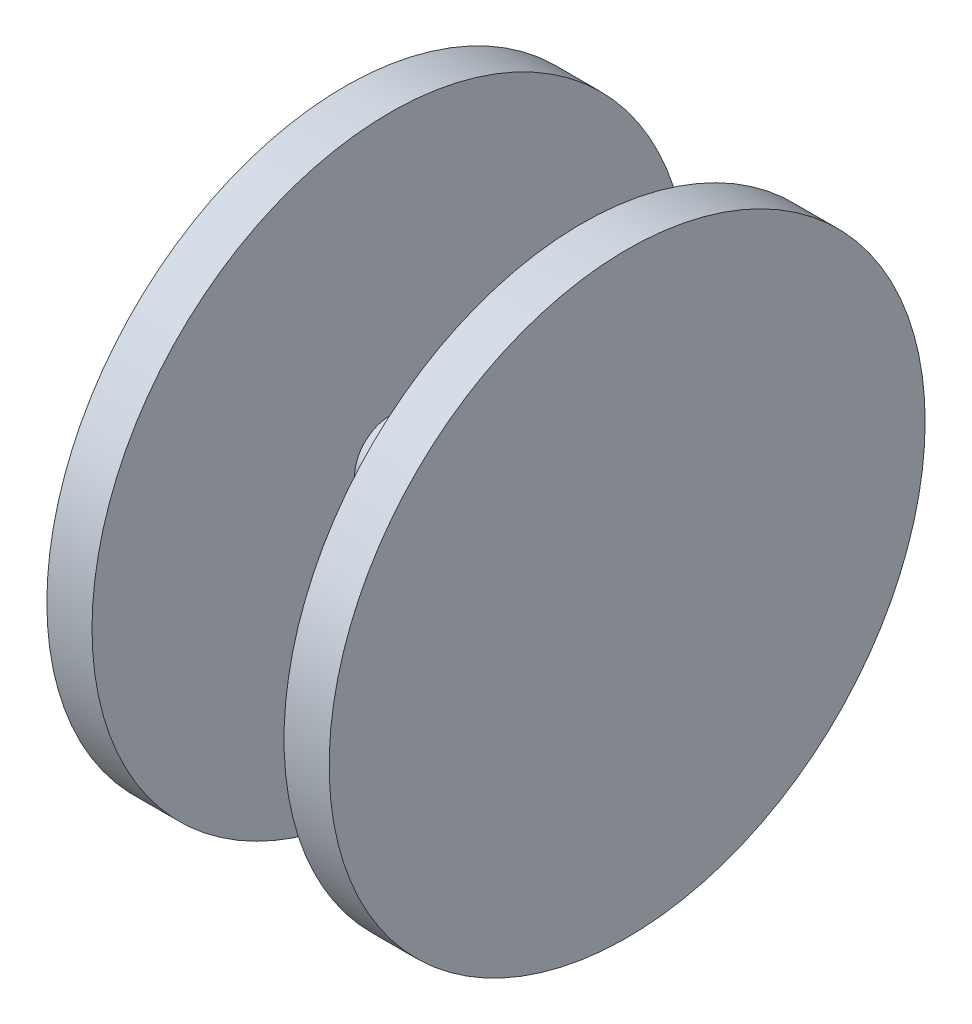
ISO-10303-21;
HEADER;
FILE_DESCRIPTION(('STEP AP214'),'2;1');
FILE_NAME('part.step','',(''),(''),'','','');
FILE_SCHEMA(('AUTOMOTIVE_DESIGN { 1 0 10303 214 1 1 1 1 }'));
ENDSEC;
DATA;
#1=APPLICATION_CONTEXT('core data for automotive mechanical design processes');
#2=APPLICATION_PROTOCOL_DEFINITION('international standard','automotive_design',2000,#1);
#3=PRODUCT_CONTEXT('',#1,'mechanical');
#4=PRODUCT('Part','Part','',(#3));
#5=PRODUCT_RELATED_PRODUCT_CATEGORY('part','',(#4));
#6=PRODUCT_DEFINITION_FORMATION('','',#4);
#7=PRODUCT_DEFINITION_CONTEXT('part definition',#1,'design');
#8=PRODUCT_DEFINITION('design','',#6,#7);
#9=PRODUCT_DEFINITION_SHAPE('','',#8);
#10=(LENGTH_UNIT() NAMED_UNIT(*) SI_UNIT(.MILLI.,.METRE.));
#11=(NAMED_UNIT(*) PLANE_ANGLE_UNIT() SI_UNIT($,.RADIAN.));
#12=(NAMED_UNIT(*) SI_UNIT($,.STERADIAN.) SOLID_ANGLE_UNIT());
#13=UNCERTAINTY_MEASURE_WITH_UNIT(LENGTH_MEASURE(1.E-05),#10,'distance_accuracy_value','');
#14=(GEOMETRIC_REPRESENTATION_CONTEXT(3) GLOBAL_UNCERTAINTY_ASSIGNED_CONTEXT((#13)) GLOBAL_UNIT_ASSIGNED_CONTEXT((#10,
#11,#12)) REPRESENTATION_CONTEXT('',''));
#15=CARTESIAN_POINT('',(0.,0.,0.));
#16=DIRECTION('',(0.,0.,1.));
#17=DIRECTION('',(1.,0.,0.));
#18=AXIS2_PLACEMENT_3D('',#15,#16,#17);
#19=CARTESIAN_POINT('',(6.35,0.,0.));
#20=DIRECTION('',(-1.,0.,0.));
#21=DIRECTION('',(0.,0.,1.));
#22=AXIS2_PLACEMENT_3D('',#19,#20,#21);
#23=CYLINDRICAL_SURFACE('',#22,41.91);
#24=CARTESIAN_POINT('',(6.35,0.,0.));
#25=DIRECTION('',(1.,0.,0.));
#26=DIRECTION('',(0.,0.,-1.));
#27=AXIS2_PLACEMENT_3D('',#24,#25,#26);
#28=CIRCLE('',#27,41.91);
#29=CARTESIAN_POINT('',(6.35,0.,-41.91));
#30=VERTEX_POINT('',#29);
#31=EDGE_CURVE('E44',#30,#30,#28,.T.);
#32=ORIENTED_EDGE('',*,*,#31,.F.);
#33=EDGE_LOOP('',(#32));
#34=FACE_BOUND('',#33,.T.);
#35=CARTESIAN_POINT('',(0.,0.,0.));
#36=DIRECTION('',(1.,0.,0.));
#37=DIRECTION('',(0.,0.,-1.));
#38=AXIS2_PLACEMENT_3D('',#35,#36,#37);
#39=CIRCLE('',#38,41.91);
#40=CARTESIAN_POINT('',(0.,0.,-41.91));
#41=VERTEX_POINT('',#40);
#42=EDGE_CURVE('E47',#41,#41,#39,.T.);
#43=ORIENTED_EDGE('',*,*,#42,.T.);
#44=EDGE_LOOP('',(#43));
#45=FACE_BOUND('',#44,.T.);
#46=ADVANCED_FACE('F39',(#34,#45),#23,.T.);
#47=CARTESIAN_POINT('',(6.35,0.,0.));
#48=DIRECTION('',(1.,0.,0.));
#49=DIRECTION('',(0.,0.,-1.));
#50=AXIS2_PLACEMENT_3D('',#47,#48,#49);
#51=PLANE('',#50);
#52=ORIENTED_EDGE('',*,*,#31,.T.);
#53=EDGE_LOOP('',(#52));
#54=FACE_BOUND('',#53,.T.);
#55=ADVANCED_FACE('F82',(#54),#51,.T.);
#56=CARTESIAN_POINT('',(0.,0.,0.));
#57=DIRECTION('',(1.,0.,0.));
#58=DIRECTION('',(0.,0.,-1.));
#59=AXIS2_PLACEMENT_3D('',#56,#57,#58);
#60=PLANE('',#59);
#61=CARTESIAN_POINT('',(0.,0.,0.));
#62=DIRECTION('',(1.,0.,0.));
#63=DIRECTION('',(0.,0.,-1.));
#64=AXIS2_PLACEMENT_3D('',#61,#62,#63);
#65=CIRCLE('',#64,5.);
#66=CARTESIAN_POINT('',(0.,0.,-5.));
#67=VERTEX_POINT('',#66);
#68=EDGE_CURVE('E10',#67,#67,#65,.F.);
#69=ORIENTED_EDGE('',*,*,#68,.F.);
#70=EDGE_LOOP('',(#69));
#71=FACE_BOUND('',#70,.T.);
#72=ORIENTED_EDGE('',*,*,#42,.F.);
#73=EDGE_LOOP('',(#72));
#74=FACE_BOUND('',#73,.T.);
#75=ADVANCED_FACE('F86',(#71,#74),#60,.F.);
#76=CARTESIAN_POINT('',(-27.,0.,0.));
#77=DIRECTION('',(1.,0.,0.));
#78=DIRECTION('',(0.,0.,-1.));
#79=AXIS2_PLACEMENT_3D('',#76,#77,#78);
#80=CYLINDRICAL_SURFACE('',#79,5.);
#81=CARTESIAN_POINT('',(-27.,0.,0.));
#82=DIRECTION('',(-1.,0.,0.));
#83=DIRECTION('',(0.,0.,1.));
#84=AXIS2_PLACEMENT_3D('',#81,#82,#83);
#85=CIRCLE('',#84,5.);
#86=CARTESIAN_POINT('',(-27.,0.,5.));
#87=VERTEX_POINT('',#86);
#88=EDGE_CURVE('E53',#87,#87,#85,.T.);
#89=ORIENTED_EDGE('',*,*,#88,.F.);
#90=EDGE_LOOP('',(#89));
#91=FACE_BOUND('',#90,.T.);
#92=ORIENTED_EDGE('',*,*,#68,.T.);
#93=EDGE_LOOP('',(#92));
#94=FACE_BOUND('',#93,.T.);
#95=ADVANCED_FACE('F66',(#91,#94),#80,.T.);
#96=CARTESIAN_POINT('',(-33.35,0.,0.));
#97=DIRECTION('',(1.,0.,0.));
#98=DIRECTION('',(0.,0.,-1.));
#99=AXIS2_PLACEMENT_3D('',#96,#97,#98);
#100=CYLINDRICAL_SURFACE('',#99,41.91);
#101=CARTESIAN_POINT('',(-33.35,0.,0.));
#102=DIRECTION('',(-1.,0.,0.));
#103=DIRECTION('',(0.,0.,1.));
#104=AXIS2_PLACEMENT_3D('',#101,#102,#103);
#105=CIRCLE('',#104,41.91);
#106=CARTESIAN_POINT('',(-33.35,0.,41.91));
#107=VERTEX_POINT('',#106);
#108=EDGE_CURVE('E59',#107,#107,#105,.T.);
#109=ORIENTED_EDGE('',*,*,#108,.F.);
#110=EDGE_LOOP('',(#109));
#111=FACE_BOUND('',#110,.T.);
#112=CARTESIAN_POINT('',(-27.,0.,0.));
#113=DIRECTION('',(-1.,0.,0.));
#114=DIRECTION('',(0.,0.,1.));
#115=AXIS2_PLACEMENT_3D('',#112,#113,#114);
#116=CIRCLE('',#115,41.91);
#117=CARTESIAN_POINT('',(-27.,0.,41.91));
#118=VERTEX_POINT('',#117);
#119=EDGE_CURVE('E56',#118,#118,#116,.T.);
#120=ORIENTED_EDGE('',*,*,#119,.T.);
#121=EDGE_LOOP('',(#120));
#122=FACE_BOUND('',#121,.T.);
#123=ADVANCED_FACE('F69',(#111,#122),#100,.T.);
#124=CARTESIAN_POINT('',(-33.35,0.,0.));
#125=DIRECTION('',(-1.,0.,0.));
#126=DIRECTION('',(0.,0.,1.));
#127=AXIS2_PLACEMENT_3D('',#124,#125,#126);
#128=PLANE('',#127);
#129=ORIENTED_EDGE('',*,*,#108,.T.);
#130=EDGE_LOOP('',(#129));
#131=FACE_BOUND('',#130,.T.);
#132=ADVANCED_FACE('F65',(#131),#128,.T.);
#133=CARTESIAN_POINT('',(-27.,0.,0.));
#134=DIRECTION('',(-1.,0.,0.));
#135=DIRECTION('',(0.,0.,1.));
#136=AXIS2_PLACEMENT_3D('',#133,#134,#135);
#137=PLANE('',#136);
#138=ORIENTED_EDGE('',*,*,#88,.T.);
#139=EDGE_LOOP('',(#138));
#140=FACE_BOUND('',#139,.T.);
#141=ORIENTED_EDGE('',*,*,#119,.F.);
#142=EDGE_LOOP('',(#141));
#143=FACE_BOUND('',#142,.T.);
#144=ADVANCED_FACE('F74',(#140,#143),#137,.F.);
#145=CLOSED_SHELL('',(#46,#55,#75,#95,#123,#132,#144));
#146=MANIFOLD_SOLID_BREP('B2',#145);
#147=ADVANCED_BREP_SHAPE_REPRESENTATION('',(#18,#146),#14);
#148=SHAPE_DEFINITION_REPRESENTATION(#9,#147);
ENDSEC;
END-ISO-10303-21;
